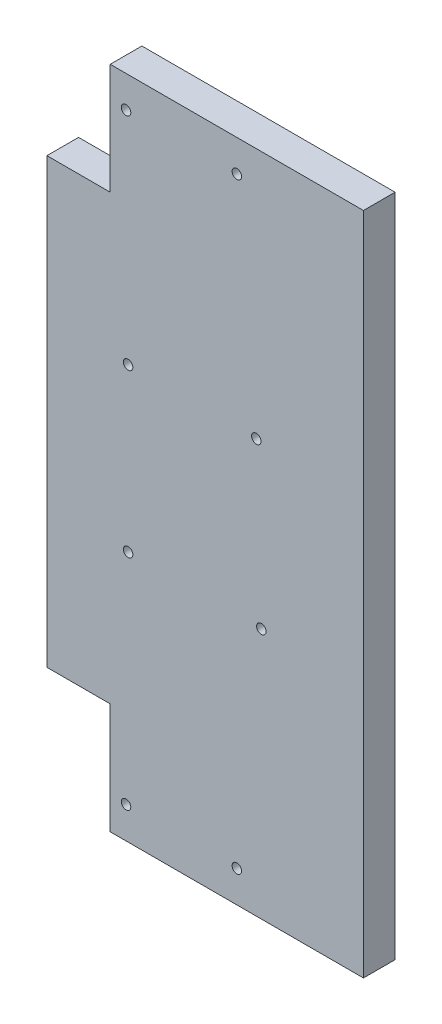
ISO-10303-21;
HEADER;
FILE_DESCRIPTION(('STEP AP214'),'2;1');
FILE_NAME('part.step','',(''),(''),'','','');
FILE_SCHEMA(('AUTOMOTIVE_DESIGN { 1 0 10303 214 1 1 1 1 }'));
ENDSEC;
DATA;
#1=APPLICATION_CONTEXT('core data for automotive mechanical design processes');
#2=APPLICATION_PROTOCOL_DEFINITION('international standard','automotive_design',2000,#1);
#3=PRODUCT_CONTEXT('',#1,'mechanical');
#4=PRODUCT('Part','Part','',(#3));
#5=PRODUCT_RELATED_PRODUCT_CATEGORY('part','',(#4));
#6=PRODUCT_DEFINITION_FORMATION('','',#4);
#7=PRODUCT_DEFINITION_CONTEXT('part definition',#1,'design');
#8=PRODUCT_DEFINITION('design','',#6,#7);
#9=PRODUCT_DEFINITION_SHAPE('','',#8);
#10=(LENGTH_UNIT() NAMED_UNIT(*) SI_UNIT(.MILLI.,.METRE.));
#11=(NAMED_UNIT(*) PLANE_ANGLE_UNIT() SI_UNIT($,.RADIAN.));
#12=(NAMED_UNIT(*) SI_UNIT($,.STERADIAN.) SOLID_ANGLE_UNIT());
#13=UNCERTAINTY_MEASURE_WITH_UNIT(LENGTH_MEASURE(1.E-05),#10,'distance_accuracy_value','');
#14=(GEOMETRIC_REPRESENTATION_CONTEXT(3) GLOBAL_UNCERTAINTY_ASSIGNED_CONTEXT((#13)) GLOBAL_UNIT_ASSIGNED_CONTEXT((#10,
#11,#12)) REPRESENTATION_CONTEXT('',''));
#15=CARTESIAN_POINT('',(0.,0.,0.));
#16=DIRECTION('',(0.,0.,1.));
#17=DIRECTION('',(1.,0.,0.));
#18=AXIS2_PLACEMENT_3D('',#15,#16,#17);
#19=CARTESIAN_POINT('',(0.,0.,10.));
#20=DIRECTION('',(1.,0.,0.));
#21=DIRECTION('',(0.,0.,-1.));
#22=AXIS2_PLACEMENT_3D('',#19,#20,#21);
#23=PLANE('',#22);
#24=DIRECTION('',(0.,0.,-1.));
#25=VECTOR('',#24,1.);
#26=CARTESIAN_POINT('',(0.,35.,10.));
#27=LINE('',#26,#25);
#28=CARTESIAN_POINT('',(0.,35.,10.));
#29=VERTEX_POINT('',#28);
#30=CARTESIAN_POINT('',(0.,35.,0.));
#31=VERTEX_POINT('',#30);
#32=EDGE_CURVE('E176',#29,#31,#27,.T.);
#33=ORIENTED_EDGE('',*,*,#32,.F.);
#34=DIRECTION('',(0.,-1.,0.));
#35=VECTOR('',#34,1.);
#36=CARTESIAN_POINT('',(0.,0.,10.));
#37=LINE('',#36,#35);
#38=CARTESIAN_POINT('',(0.,175.,10.));
#39=VERTEX_POINT('',#38);
#40=EDGE_CURVE('E120',#39,#29,#37,.T.);
#41=ORIENTED_EDGE('',*,*,#40,.F.);
#42=DIRECTION('',(0.,0.,-1.));
#43=VECTOR('',#42,1.);
#44=CARTESIAN_POINT('',(0.,175.,10.));
#45=LINE('',#44,#43);
#46=CARTESIAN_POINT('',(0.,175.,0.));
#47=VERTEX_POINT('',#46);
#48=EDGE_CURVE('E134',#39,#47,#45,.T.);
#49=ORIENTED_EDGE('',*,*,#48,.T.);
#50=DIRECTION('',(0.,-1.,0.));
#51=VECTOR('',#50,1.);
#52=CARTESIAN_POINT('',(0.,0.,0.));
#53=LINE('',#52,#51);
#54=EDGE_CURVE('E130',#47,#31,#53,.T.);
#55=ORIENTED_EDGE('',*,*,#54,.T.);
#56=EDGE_LOOP('',(#33,#41,#49,#55));
#57=FACE_BOUND('',#56,.T.);
#58=ADVANCED_FACE('F35',(#57),#23,.F.);
#59=CARTESIAN_POINT('',(0.,0.,10.));
#60=DIRECTION('',(0.,0.,-1.));
#61=DIRECTION('',(-1.,0.,0.));
#62=AXIS2_PLACEMENT_3D('',#59,#60,#61);
#63=PLANE('',#62);
#64=CARTESIAN_POINT('',(25.6458895005593,79.3859256734279,10.));
#65=DIRECTION('',(0.,0.,-1.));
#66=DIRECTION('',(-1.,0.,0.));
#67=AXIS2_PLACEMENT_3D('',#64,#65,#66);
#68=CIRCLE('',#67,1.5);
#69=CARTESIAN_POINT('',(24.1458895005593,79.3859256734279,10.));
#70=VERTEX_POINT('',#69);
#71=EDGE_CURVE('E246',#70,#70,#68,.T.);
#72=ORIENTED_EDGE('',*,*,#71,.T.);
#73=EDGE_LOOP('',(#72));
#74=FACE_BOUND('',#73,.T.);
#75=CARTESIAN_POINT('',(67.7422512853951,79.3859256734279,10.));
#76=DIRECTION('',(0.,0.,-1.));
#77=DIRECTION('',(-1.,0.,0.));
#78=AXIS2_PLACEMENT_3D('',#75,#76,#77);
#79=CIRCLE('',#78,1.5);
#80=CARTESIAN_POINT('',(66.2422512853951,79.3859256734279,10.));
#81=VERTEX_POINT('',#80);
#82=EDGE_CURVE('E250',#81,#81,#79,.T.);
#83=ORIENTED_EDGE('',*,*,#82,.T.);
#84=EDGE_LOOP('',(#83));
#85=FACE_BOUND('',#84,.T.);
#86=CARTESIAN_POINT('',(66.1619974329568,130.6337430788,10.));
#87=DIRECTION('',(0.,0.,-1.));
#88=DIRECTION('',(-1.,0.,0.));
#89=AXIS2_PLACEMENT_3D('',#86,#87,#88);
#90=CIRCLE('',#89,1.5);
#91=CARTESIAN_POINT('',(64.6619974329568,130.6337430788,10.));
#92=VERTEX_POINT('',#91);
#93=EDGE_CURVE('E260',#92,#92,#90,.T.);
#94=ORIENTED_EDGE('',*,*,#93,.T.);
#95=EDGE_LOOP('',(#94));
#96=FACE_BOUND('',#95,.T.);
#97=CARTESIAN_POINT('',(25.6458895005593,130.6337430788,10.));
#98=DIRECTION('',(0.,0.,-1.));
#99=DIRECTION('',(-1.,0.,0.));
#100=AXIS2_PLACEMENT_3D('',#97,#98,#99);
#101=CIRCLE('',#100,1.5);
#102=CARTESIAN_POINT('',(24.1458895005593,130.6337430788,10.));
#103=VERTEX_POINT('',#102);
#104=EDGE_CURVE('E266',#103,#103,#101,.T.);
#105=ORIENTED_EDGE('',*,*,#104,.T.);
#106=EDGE_LOOP('',(#105));
#107=FACE_BOUND('',#106,.T.);
#108=CARTESIAN_POINT('',(60.,200.,10.));
#109=DIRECTION('',(0.,0.,-1.));
#110=DIRECTION('',(-1.,0.,0.));
#111=AXIS2_PLACEMENT_3D('',#108,#109,#110);
#112=CIRCLE('',#111,1.5);
#113=CARTESIAN_POINT('',(58.5,200.,10.));
#114=VERTEX_POINT('',#113);
#115=EDGE_CURVE('E272',#114,#114,#112,.T.);
#116=ORIENTED_EDGE('',*,*,#115,.T.);
#117=EDGE_LOOP('',(#116));
#118=FACE_BOUND('',#117,.T.);
#119=CARTESIAN_POINT('',(25.,10.,10.));
#120=DIRECTION('',(0.,0.,-1.));
#121=DIRECTION('',(-1.,0.,0.));
#122=AXIS2_PLACEMENT_3D('',#119,#120,#121);
#123=CIRCLE('',#122,1.5);
#124=CARTESIAN_POINT('',(23.5,10.,10.));
#125=VERTEX_POINT('',#124);
#126=EDGE_CURVE('E279',#125,#125,#123,.T.);
#127=ORIENTED_EDGE('',*,*,#126,.T.);
#128=EDGE_LOOP('',(#127));
#129=FACE_BOUND('',#128,.T.);
#130=CARTESIAN_POINT('',(60.,10.,10.));
#131=DIRECTION('',(0.,0.,-1.));
#132=DIRECTION('',(-1.,0.,0.));
#133=AXIS2_PLACEMENT_3D('',#130,#131,#132);
#134=CIRCLE('',#133,1.5);
#135=CARTESIAN_POINT('',(58.5,10.,10.));
#136=VERTEX_POINT('',#135);
#137=EDGE_CURVE('E285',#136,#136,#134,.T.);
#138=ORIENTED_EDGE('',*,*,#137,.T.);
#139=EDGE_LOOP('',(#138));
#140=FACE_BOUND('',#139,.T.);
#141=CARTESIAN_POINT('',(25.,200.,10.));
#142=DIRECTION('',(0.,0.,-1.));
#143=DIRECTION('',(-1.,0.,0.));
#144=AXIS2_PLACEMENT_3D('',#141,#142,#143);
#145=CIRCLE('',#144,1.5);
#146=CARTESIAN_POINT('',(23.5,200.,10.));
#147=VERTEX_POINT('',#146);
#148=EDGE_CURVE('E172',#147,#147,#145,.T.);
#149=ORIENTED_EDGE('',*,*,#148,.T.);
#150=EDGE_LOOP('',(#149));
#151=FACE_BOUND('',#150,.T.);
#152=DIRECTION('',(0.,1.,0.));
#153=VECTOR('',#152,1.);
#154=CARTESIAN_POINT('',(20.,35.,10.));
#155=LINE('',#154,#153);
#156=CARTESIAN_POINT('',(20.,0.,10.));
#157=VERTEX_POINT('',#156);
#158=CARTESIAN_POINT('',(20.,35.,10.));
#159=VERTEX_POINT('',#158);
#160=EDGE_CURVE('E100',#157,#159,#155,.T.);
#161=ORIENTED_EDGE('',*,*,#160,.F.);
#162=DIRECTION('',(1.,0.,0.));
#163=VECTOR('',#162,1.);
#164=CARTESIAN_POINT('',(0.,0.,10.));
#165=LINE('',#164,#163);
#166=CARTESIAN_POINT('',(100.,0.,10.));
#167=VERTEX_POINT('',#166);
#168=EDGE_CURVE('E111',#157,#167,#165,.T.);
#169=ORIENTED_EDGE('',*,*,#168,.T.);
#170=DIRECTION('',(0.,1.,0.));
#171=VECTOR('',#170,1.);
#172=CARTESIAN_POINT('',(100.,0.,10.));
#173=LINE('',#172,#171);
#174=CARTESIAN_POINT('',(100.,210.,10.));
#175=VERTEX_POINT('',#174);
#176=EDGE_CURVE('E119',#167,#175,#173,.T.);
#177=ORIENTED_EDGE('',*,*,#176,.T.);
#178=DIRECTION('',(-1.,0.,0.));
#179=VECTOR('',#178,1.);
#180=CARTESIAN_POINT('',(0.,210.,10.));
#181=LINE('',#180,#179);
#182=CARTESIAN_POINT('',(20.,210.,10.));
#183=VERTEX_POINT('',#182);
#184=EDGE_CURVE('E122',#175,#183,#181,.T.);
#185=ORIENTED_EDGE('',*,*,#184,.T.);
#186=DIRECTION('',(0.,1.,0.));
#187=VECTOR('',#186,1.);
#188=CARTESIAN_POINT('',(20.,175.,10.));
#189=LINE('',#188,#187);
#190=CARTESIAN_POINT('',(20.,175.,10.));
#191=VERTEX_POINT('',#190);
#192=EDGE_CURVE('E155',#191,#183,#189,.T.);
#193=ORIENTED_EDGE('',*,*,#192,.F.);
#194=DIRECTION('',(1.,0.,0.));
#195=VECTOR('',#194,1.);
#196=CARTESIAN_POINT('',(0.,175.,10.));
#197=LINE('',#196,#195);
#198=EDGE_CURVE('E153',#39,#191,#197,.T.);
#199=ORIENTED_EDGE('',*,*,#198,.F.);
#200=ORIENTED_EDGE('',*,*,#40,.T.);
#201=DIRECTION('',(-1.,0.,0.));
#202=VECTOR('',#201,1.);
#203=CARTESIAN_POINT('',(0.,35.,10.));
#204=LINE('',#203,#202);
#205=EDGE_CURVE('E114',#159,#29,#204,.T.);
#206=ORIENTED_EDGE('',*,*,#205,.F.);
#207=EDGE_LOOP('',(#161,#169,#177,#185,#193,#199,#200,#206));
#208=FACE_BOUND('',#207,.T.);
#209=ADVANCED_FACE('F110',(#74,#85,#96,#107,#118,#129,#140,#151,#208),#63,.F.);
#210=CARTESIAN_POINT('',(0.,0.,0.));
#211=DIRECTION('',(0.,0.,-1.));
#212=DIRECTION('',(-1.,0.,0.));
#213=AXIS2_PLACEMENT_3D('',#210,#211,#212);
#214=PLANE('',#213);
#215=CARTESIAN_POINT('',(25.6458895005593,79.3859256734279,0.));
#216=DIRECTION('',(0.,0.,-1.));
#217=DIRECTION('',(-1.,0.,0.));
#218=AXIS2_PLACEMENT_3D('',#215,#216,#217);
#219=CIRCLE('',#218,1.5);
#220=CARTESIAN_POINT('',(24.1458895005593,79.3859256734279,0.));
#221=VERTEX_POINT('',#220);
#222=EDGE_CURVE('E249',#221,#221,#219,.T.);
#223=ORIENTED_EDGE('',*,*,#222,.F.);
#224=EDGE_LOOP('',(#223));
#225=FACE_BOUND('',#224,.T.);
#226=CARTESIAN_POINT('',(67.7422512853951,79.3859256734279,0.));
#227=DIRECTION('',(0.,0.,-1.));
#228=DIRECTION('',(-1.,0.,0.));
#229=AXIS2_PLACEMENT_3D('',#226,#227,#228);
#230=CIRCLE('',#229,1.5);
#231=CARTESIAN_POINT('',(66.2422512853951,79.3859256734279,0.));
#232=VERTEX_POINT('',#231);
#233=EDGE_CURVE('E255',#232,#232,#230,.T.);
#234=ORIENTED_EDGE('',*,*,#233,.F.);
#235=EDGE_LOOP('',(#234));
#236=FACE_BOUND('',#235,.T.);
#237=CARTESIAN_POINT('',(66.1619974329568,130.6337430788,0.));
#238=DIRECTION('',(0.,0.,-1.));
#239=DIRECTION('',(-1.,0.,0.));
#240=AXIS2_PLACEMENT_3D('',#237,#238,#239);
#241=CIRCLE('',#240,1.5);
#242=CARTESIAN_POINT('',(64.6619974329568,130.6337430788,0.));
#243=VERTEX_POINT('',#242);
#244=EDGE_CURVE('E263',#243,#243,#241,.T.);
#245=ORIENTED_EDGE('',*,*,#244,.F.);
#246=EDGE_LOOP('',(#245));
#247=FACE_BOUND('',#246,.T.);
#248=CARTESIAN_POINT('',(25.6458895005593,130.6337430788,0.));
#249=DIRECTION('',(0.,0.,-1.));
#250=DIRECTION('',(-1.,0.,0.));
#251=AXIS2_PLACEMENT_3D('',#248,#249,#250);
#252=CIRCLE('',#251,1.5);
#253=CARTESIAN_POINT('',(24.1458895005593,130.6337430788,0.));
#254=VERTEX_POINT('',#253);
#255=EDGE_CURVE('E252',#254,#254,#252,.T.);
#256=ORIENTED_EDGE('',*,*,#255,.F.);
#257=EDGE_LOOP('',(#256));
#258=FACE_BOUND('',#257,.T.);
#259=CARTESIAN_POINT('',(60.,200.,0.));
#260=DIRECTION('',(0.,0.,-1.));
#261=DIRECTION('',(-1.,0.,0.));
#262=AXIS2_PLACEMENT_3D('',#259,#260,#261);
#263=CIRCLE('',#262,1.5);
#264=CARTESIAN_POINT('',(58.5,200.,0.));
#265=VERTEX_POINT('',#264);
#266=EDGE_CURVE('E276',#265,#265,#263,.T.);
#267=ORIENTED_EDGE('',*,*,#266,.F.);
#268=EDGE_LOOP('',(#267));
#269=FACE_BOUND('',#268,.T.);
#270=CARTESIAN_POINT('',(25.,10.,0.));
#271=DIRECTION('',(0.,0.,-1.));
#272=DIRECTION('',(-1.,0.,0.));
#273=AXIS2_PLACEMENT_3D('',#270,#271,#272);
#274=CIRCLE('',#273,1.5);
#275=CARTESIAN_POINT('',(23.5,10.,0.));
#276=VERTEX_POINT('',#275);
#277=EDGE_CURVE('E282',#276,#276,#274,.T.);
#278=ORIENTED_EDGE('',*,*,#277,.F.);
#279=EDGE_LOOP('',(#278));
#280=FACE_BOUND('',#279,.T.);
#281=CARTESIAN_POINT('',(60.,10.,0.));
#282=DIRECTION('',(0.,0.,-1.));
#283=DIRECTION('',(-1.,0.,0.));
#284=AXIS2_PLACEMENT_3D('',#281,#282,#283);
#285=CIRCLE('',#284,1.5);
#286=CARTESIAN_POINT('',(58.5,10.,0.));
#287=VERTEX_POINT('',#286);
#288=EDGE_CURVE('E269',#287,#287,#285,.T.);
#289=ORIENTED_EDGE('',*,*,#288,.F.);
#290=EDGE_LOOP('',(#289));
#291=FACE_BOUND('',#290,.T.);
#292=CARTESIAN_POINT('',(25.,200.,0.));
#293=DIRECTION('',(0.,0.,-1.));
#294=DIRECTION('',(-1.,0.,0.));
#295=AXIS2_PLACEMENT_3D('',#292,#293,#294);
#296=CIRCLE('',#295,1.5);
#297=CARTESIAN_POINT('',(23.5,200.,0.));
#298=VERTEX_POINT('',#297);
#299=EDGE_CURVE('E275',#298,#298,#296,.T.);
#300=ORIENTED_EDGE('',*,*,#299,.F.);
#301=EDGE_LOOP('',(#300));
#302=FACE_BOUND('',#301,.T.);
#303=DIRECTION('',(1.,0.,0.));
#304=VECTOR('',#303,1.);
#305=CARTESIAN_POINT('',(0.,0.,0.));
#306=LINE('',#305,#304);
#307=CARTESIAN_POINT('',(20.,0.,0.));
#308=VERTEX_POINT('',#307);
#309=CARTESIAN_POINT('',(100.,0.,0.));
#310=VERTEX_POINT('',#309);
#311=EDGE_CURVE('E133',#308,#310,#306,.T.);
#312=ORIENTED_EDGE('',*,*,#311,.F.);
#313=DIRECTION('',(0.,1.,0.));
#314=VECTOR('',#313,1.);
#315=CARTESIAN_POINT('',(20.,35.,0.));
#316=LINE('',#315,#314);
#317=CARTESIAN_POINT('',(20.,35.,0.));
#318=VERTEX_POINT('',#317);
#319=EDGE_CURVE('E49',#308,#318,#316,.T.);
#320=ORIENTED_EDGE('',*,*,#319,.T.);
#321=DIRECTION('',(-1.,0.,0.));
#322=VECTOR('',#321,1.);
#323=CARTESIAN_POINT('',(0.,35.,0.));
#324=LINE('',#323,#322);
#325=EDGE_CURVE('E115',#318,#31,#324,.T.);
#326=ORIENTED_EDGE('',*,*,#325,.T.);
#327=ORIENTED_EDGE('',*,*,#54,.F.);
#328=DIRECTION('',(1.,0.,0.));
#329=VECTOR('',#328,1.);
#330=CARTESIAN_POINT('',(0.,175.,0.));
#331=LINE('',#330,#329);
#332=CARTESIAN_POINT('',(20.,175.,0.));
#333=VERTEX_POINT('',#332);
#334=EDGE_CURVE('E105',#47,#333,#331,.T.);
#335=ORIENTED_EDGE('',*,*,#334,.T.);
#336=DIRECTION('',(0.,1.,0.));
#337=VECTOR('',#336,1.);
#338=CARTESIAN_POINT('',(20.,175.,0.));
#339=LINE('',#338,#337);
#340=CARTESIAN_POINT('',(20.,210.,0.));
#341=VERTEX_POINT('',#340);
#342=EDGE_CURVE('E150',#333,#341,#339,.T.);
#343=ORIENTED_EDGE('',*,*,#342,.T.);
#344=DIRECTION('',(-1.,0.,0.));
#345=VECTOR('',#344,1.);
#346=CARTESIAN_POINT('',(0.,210.,0.));
#347=LINE('',#346,#345);
#348=CARTESIAN_POINT('',(100.,210.,0.));
#349=VERTEX_POINT('',#348);
#350=EDGE_CURVE('E124',#349,#341,#347,.T.);
#351=ORIENTED_EDGE('',*,*,#350,.F.);
#352=DIRECTION('',(0.,1.,0.));
#353=VECTOR('',#352,1.);
#354=CARTESIAN_POINT('',(100.,0.,0.));
#355=LINE('',#354,#353);
#356=EDGE_CURVE('E136',#310,#349,#355,.T.);
#357=ORIENTED_EDGE('',*,*,#356,.F.);
#358=EDGE_LOOP('',(#312,#320,#326,#327,#335,#343,#351,#357));
#359=FACE_BOUND('',#358,.T.);
#360=ADVANCED_FACE('F148',(#225,#236,#247,#258,#269,#280,#291,#302,#359),#214,.T.);
#361=CARTESIAN_POINT('',(0.,0.,10.));
#362=DIRECTION('',(0.,1.,0.));
#363=DIRECTION('',(0.,0.,1.));
#364=AXIS2_PLACEMENT_3D('',#361,#362,#363);
#365=PLANE('',#364);
#366=DIRECTION('',(0.,0.,-1.));
#367=VECTOR('',#366,1.);
#368=CARTESIAN_POINT('',(20.,0.,10.));
#369=LINE('',#368,#367);
#370=EDGE_CURVE('E97',#157,#308,#369,.T.);
#371=ORIENTED_EDGE('',*,*,#370,.T.);
#372=ORIENTED_EDGE('',*,*,#311,.T.);
#373=DIRECTION('',(0.,0.,-1.));
#374=VECTOR('',#373,1.);
#375=CARTESIAN_POINT('',(100.,0.,10.));
#376=LINE('',#375,#374);
#377=EDGE_CURVE('E11',#167,#310,#376,.T.);
#378=ORIENTED_EDGE('',*,*,#377,.F.);
#379=ORIENTED_EDGE('',*,*,#168,.F.);
#380=EDGE_LOOP('',(#371,#372,#378,#379));
#381=FACE_BOUND('',#380,.T.);
#382=ADVANCED_FACE('F117',(#381),#365,.F.);
#383=CARTESIAN_POINT('',(0.,210.,10.));
#384=DIRECTION('',(0.,-1.,0.));
#385=DIRECTION('',(0.,0.,-1.));
#386=AXIS2_PLACEMENT_3D('',#383,#384,#385);
#387=PLANE('',#386);
#388=DIRECTION('',(0.,0.,-1.));
#389=VECTOR('',#388,1.);
#390=CARTESIAN_POINT('',(20.,210.,10.));
#391=LINE('',#390,#389);
#392=EDGE_CURVE('E57',#183,#341,#391,.T.);
#393=ORIENTED_EDGE('',*,*,#392,.F.);
#394=ORIENTED_EDGE('',*,*,#184,.F.);
#395=DIRECTION('',(0.,0.,-1.));
#396=VECTOR('',#395,1.);
#397=CARTESIAN_POINT('',(100.,210.,10.));
#398=LINE('',#397,#396);
#399=EDGE_CURVE('E42',#175,#349,#398,.T.);
#400=ORIENTED_EDGE('',*,*,#399,.T.);
#401=ORIENTED_EDGE('',*,*,#350,.T.);
#402=EDGE_LOOP('',(#393,#394,#400,#401));
#403=FACE_BOUND('',#402,.T.);
#404=ADVANCED_FACE('F144',(#403),#387,.F.);
#405=CARTESIAN_POINT('',(100.,0.,10.));
#406=DIRECTION('',(-1.,0.,0.));
#407=DIRECTION('',(0.,0.,1.));
#408=AXIS2_PLACEMENT_3D('',#405,#406,#407);
#409=PLANE('',#408);
#410=ORIENTED_EDGE('',*,*,#356,.T.);
#411=ORIENTED_EDGE('',*,*,#399,.F.);
#412=ORIENTED_EDGE('',*,*,#176,.F.);
#413=ORIENTED_EDGE('',*,*,#377,.T.);
#414=EDGE_LOOP('',(#410,#411,#412,#413));
#415=FACE_BOUND('',#414,.T.);
#416=ADVANCED_FACE('F180',(#415),#409,.F.);
#417=CARTESIAN_POINT('',(0.,175.,10.));
#418=DIRECTION('',(0.,1.,0.));
#419=DIRECTION('',(0.,0.,1.));
#420=AXIS2_PLACEMENT_3D('',#417,#418,#419);
#421=PLANE('',#420);
#422=ORIENTED_EDGE('',*,*,#334,.F.);
#423=ORIENTED_EDGE('',*,*,#48,.F.);
#424=ORIENTED_EDGE('',*,*,#198,.T.);
#425=DIRECTION('',(0.,0.,-1.));
#426=VECTOR('',#425,1.);
#427=CARTESIAN_POINT('',(20.,175.,10.));
#428=LINE('',#427,#426);
#429=EDGE_CURVE('E161',#191,#333,#428,.T.);
#430=ORIENTED_EDGE('',*,*,#429,.T.);
#431=EDGE_LOOP('',(#422,#423,#424,#430));
#432=FACE_BOUND('',#431,.T.);
#433=ADVANCED_FACE('F182',(#432),#421,.T.);
#434=CARTESIAN_POINT('',(20.,175.,10.));
#435=DIRECTION('',(-1.,0.,0.));
#436=DIRECTION('',(0.,-1.,0.));
#437=AXIS2_PLACEMENT_3D('',#434,#435,#436);
#438=PLANE('',#437);
#439=ORIENTED_EDGE('',*,*,#342,.F.);
#440=ORIENTED_EDGE('',*,*,#429,.F.);
#441=ORIENTED_EDGE('',*,*,#192,.T.);
#442=ORIENTED_EDGE('',*,*,#392,.T.);
#443=EDGE_LOOP('',(#439,#440,#441,#442));
#444=FACE_BOUND('',#443,.T.);
#445=ADVANCED_FACE('F179',(#444),#438,.T.);
#446=CARTESIAN_POINT('',(20.,35.,10.));
#447=DIRECTION('',(-1.,0.,0.));
#448=DIRECTION('',(0.,-1.,0.));
#449=AXIS2_PLACEMENT_3D('',#446,#447,#448);
#450=PLANE('',#449);
#451=ORIENTED_EDGE('',*,*,#319,.F.);
#452=ORIENTED_EDGE('',*,*,#370,.F.);
#453=ORIENTED_EDGE('',*,*,#160,.T.);
#454=DIRECTION('',(0.,0.,-1.));
#455=VECTOR('',#454,1.);
#456=CARTESIAN_POINT('',(20.,35.,10.));
#457=LINE('',#456,#455);
#458=EDGE_CURVE('E106',#159,#318,#457,.T.);
#459=ORIENTED_EDGE('',*,*,#458,.T.);
#460=EDGE_LOOP('',(#451,#452,#453,#459));
#461=FACE_BOUND('',#460,.T.);
#462=ADVANCED_FACE('F99',(#461),#450,.T.);
#463=CARTESIAN_POINT('',(0.,35.,10.));
#464=DIRECTION('',(0.,-1.,0.));
#465=DIRECTION('',(0.,0.,-1.));
#466=AXIS2_PLACEMENT_3D('',#463,#464,#465);
#467=PLANE('',#466);
#468=ORIENTED_EDGE('',*,*,#325,.F.);
#469=ORIENTED_EDGE('',*,*,#458,.F.);
#470=ORIENTED_EDGE('',*,*,#205,.T.);
#471=ORIENTED_EDGE('',*,*,#32,.T.);
#472=EDGE_LOOP('',(#468,#469,#470,#471));
#473=FACE_BOUND('',#472,.T.);
#474=ADVANCED_FACE('F208',(#473),#467,.T.);
#475=CARTESIAN_POINT('',(25.,200.,10.));
#476=DIRECTION('',(0.,0.,-1.));
#477=DIRECTION('',(-1.,0.,0.));
#478=AXIS2_PLACEMENT_3D('',#475,#476,#477);
#479=CYLINDRICAL_SURFACE('',#478,1.5);
#480=ORIENTED_EDGE('',*,*,#148,.F.);
#481=EDGE_LOOP('',(#480));
#482=FACE_BOUND('',#481,.T.);
#483=ORIENTED_EDGE('',*,*,#299,.T.);
#484=EDGE_LOOP('',(#483));
#485=FACE_BOUND('',#484,.T.);
#486=ADVANCED_FACE('F211',(#482,#485),#479,.F.);
#487=CARTESIAN_POINT('',(60.,10.,10.));
#488=DIRECTION('',(0.,0.,-1.));
#489=DIRECTION('',(-1.,0.,0.));
#490=AXIS2_PLACEMENT_3D('',#487,#488,#489);
#491=CYLINDRICAL_SURFACE('',#490,1.5);
#492=ORIENTED_EDGE('',*,*,#137,.F.);
#493=EDGE_LOOP('',(#492));
#494=FACE_BOUND('',#493,.T.);
#495=ORIENTED_EDGE('',*,*,#288,.T.);
#496=EDGE_LOOP('',(#495));
#497=FACE_BOUND('',#496,.T.);
#498=ADVANCED_FACE('F214',(#494,#497),#491,.F.);
#499=CARTESIAN_POINT('',(25.,10.,10.));
#500=DIRECTION('',(0.,0.,-1.));
#501=DIRECTION('',(-1.,0.,0.));
#502=AXIS2_PLACEMENT_3D('',#499,#500,#501);
#503=CYLINDRICAL_SURFACE('',#502,1.5);
#504=ORIENTED_EDGE('',*,*,#126,.F.);
#505=EDGE_LOOP('',(#504));
#506=FACE_BOUND('',#505,.T.);
#507=ORIENTED_EDGE('',*,*,#277,.T.);
#508=EDGE_LOOP('',(#507));
#509=FACE_BOUND('',#508,.T.);
#510=ADVANCED_FACE('F218',(#506,#509),#503,.F.);
#511=CARTESIAN_POINT('',(60.,200.,10.));
#512=DIRECTION('',(0.,0.,-1.));
#513=DIRECTION('',(-1.,0.,0.));
#514=AXIS2_PLACEMENT_3D('',#511,#512,#513);
#515=CYLINDRICAL_SURFACE('',#514,1.5);
#516=ORIENTED_EDGE('',*,*,#115,.F.);
#517=EDGE_LOOP('',(#516));
#518=FACE_BOUND('',#517,.T.);
#519=ORIENTED_EDGE('',*,*,#266,.T.);
#520=EDGE_LOOP('',(#519));
#521=FACE_BOUND('',#520,.T.);
#522=ADVANCED_FACE('F222',(#518,#521),#515,.F.);
#523=CARTESIAN_POINT('',(25.6458895005593,130.6337430788,10.));
#524=DIRECTION('',(0.,0.,-1.));
#525=DIRECTION('',(-1.,0.,0.));
#526=AXIS2_PLACEMENT_3D('',#523,#524,#525);
#527=CYLINDRICAL_SURFACE('',#526,1.5);
#528=ORIENTED_EDGE('',*,*,#104,.F.);
#529=EDGE_LOOP('',(#528));
#530=FACE_BOUND('',#529,.T.);
#531=ORIENTED_EDGE('',*,*,#255,.T.);
#532=EDGE_LOOP('',(#531));
#533=FACE_BOUND('',#532,.T.);
#534=ADVANCED_FACE('F226',(#530,#533),#527,.F.);
#535=CARTESIAN_POINT('',(66.1619974329568,130.6337430788,10.));
#536=DIRECTION('',(0.,0.,-1.));
#537=DIRECTION('',(-1.,0.,0.));
#538=AXIS2_PLACEMENT_3D('',#535,#536,#537);
#539=CYLINDRICAL_SURFACE('',#538,1.5);
#540=ORIENTED_EDGE('',*,*,#93,.F.);
#541=EDGE_LOOP('',(#540));
#542=FACE_BOUND('',#541,.T.);
#543=ORIENTED_EDGE('',*,*,#244,.T.);
#544=EDGE_LOOP('',(#543));
#545=FACE_BOUND('',#544,.T.);
#546=ADVANCED_FACE('F230',(#542,#545),#539,.F.);
#547=CARTESIAN_POINT('',(67.7422512853951,79.3859256734279,10.));
#548=DIRECTION('',(0.,0.,-1.));
#549=DIRECTION('',(-1.,0.,0.));
#550=AXIS2_PLACEMENT_3D('',#547,#548,#549);
#551=CYLINDRICAL_SURFACE('',#550,1.5);
#552=ORIENTED_EDGE('',*,*,#82,.F.);
#553=EDGE_LOOP('',(#552));
#554=FACE_BOUND('',#553,.T.);
#555=ORIENTED_EDGE('',*,*,#233,.T.);
#556=EDGE_LOOP('',(#555));
#557=FACE_BOUND('',#556,.T.);
#558=ADVANCED_FACE('F234',(#554,#557),#551,.F.);
#559=CARTESIAN_POINT('',(25.6458895005593,79.3859256734279,10.));
#560=DIRECTION('',(0.,0.,-1.));
#561=DIRECTION('',(-1.,0.,0.));
#562=AXIS2_PLACEMENT_3D('',#559,#560,#561);
#563=CYLINDRICAL_SURFACE('',#562,1.5);
#564=ORIENTED_EDGE('',*,*,#71,.F.);
#565=EDGE_LOOP('',(#564));
#566=FACE_BOUND('',#565,.T.);
#567=ORIENTED_EDGE('',*,*,#222,.T.);
#568=EDGE_LOOP('',(#567));
#569=FACE_BOUND('',#568,.T.);
#570=ADVANCED_FACE('F238',(#566,#569),#563,.F.);
#571=CLOSED_SHELL('',(#58,#209,#360,#382,#404,#416,#433,#445,#462,#474,#486,#498,#510,#522,#534,
#546,#558,#570));
#572=MANIFOLD_SOLID_BREP('B2',#571);
#573=ADVANCED_BREP_SHAPE_REPRESENTATION('',(#18,#572),#14);
#574=SHAPE_DEFINITION_REPRESENTATION(#9,#573);
ENDSEC;
END-ISO-10303-21;
